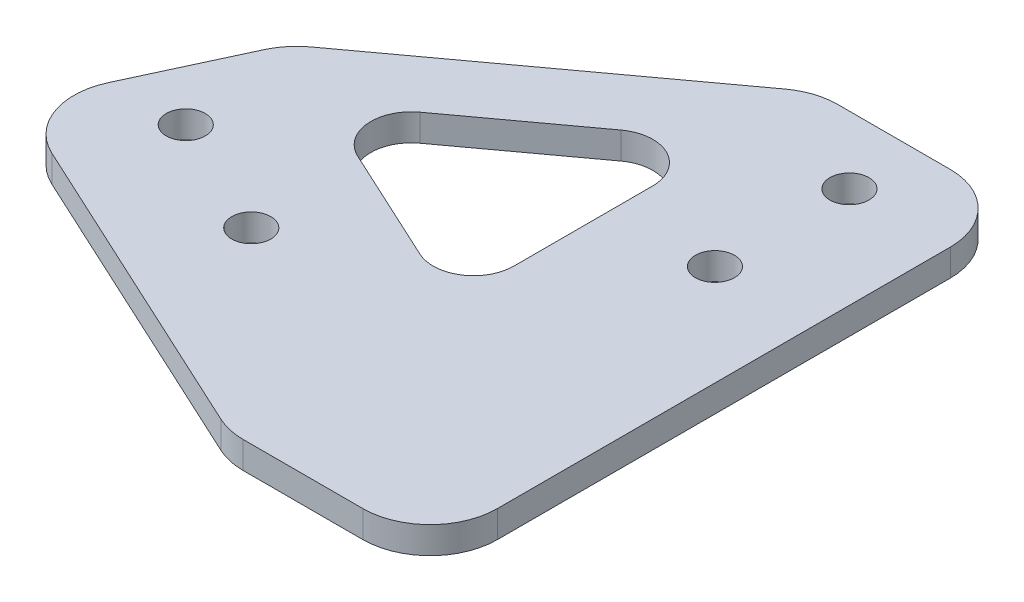
ISO-10303-21;
HEADER;
FILE_DESCRIPTION(('STEP AP214'),'2;1');
FILE_NAME('part.step','',(''),(''),'','','');
FILE_SCHEMA(('AUTOMOTIVE_DESIGN { 1 0 10303 214 1 1 1 1 }'));
ENDSEC;
DATA;
#1=APPLICATION_CONTEXT('core data for automotive mechanical design processes');
#2=APPLICATION_PROTOCOL_DEFINITION('international standard','automotive_design',2000,#1);
#3=PRODUCT_CONTEXT('',#1,'mechanical');
#4=PRODUCT('Part','Part','',(#3));
#5=PRODUCT_RELATED_PRODUCT_CATEGORY('part','',(#4));
#6=PRODUCT_DEFINITION_FORMATION('','',#4);
#7=PRODUCT_DEFINITION_CONTEXT('part definition',#1,'design');
#8=PRODUCT_DEFINITION('design','',#6,#7);
#9=PRODUCT_DEFINITION_SHAPE('','',#8);
#10=(LENGTH_UNIT() NAMED_UNIT(*) SI_UNIT(.MILLI.,.METRE.));
#11=(NAMED_UNIT(*) PLANE_ANGLE_UNIT() SI_UNIT($,.RADIAN.));
#12=(NAMED_UNIT(*) SI_UNIT($,.STERADIAN.) SOLID_ANGLE_UNIT());
#13=UNCERTAINTY_MEASURE_WITH_UNIT(LENGTH_MEASURE(1.E-05),#10,'distance_accuracy_value','');
#14=(GEOMETRIC_REPRESENTATION_CONTEXT(3) GLOBAL_UNCERTAINTY_ASSIGNED_CONTEXT((#13)) GLOBAL_UNIT_ASSIGNED_CONTEXT((#10,
#11,#12)) REPRESENTATION_CONTEXT('',''));
#15=CARTESIAN_POINT('',(0.,0.,0.));
#16=DIRECTION('',(0.,0.,1.));
#17=DIRECTION('',(1.,0.,0.));
#18=AXIS2_PLACEMENT_3D('',#15,#16,#17);
#19=CARTESIAN_POINT('',(0.,2.,0.));
#20=DIRECTION('',(0.,1.,0.));
#21=DIRECTION('',(0.,0.,1.));
#22=AXIS2_PLACEMENT_3D('',#19,#20,#21);
#23=PLANE('',#22);
#24=CARTESIAN_POINT('',(237.500000000001,2.,86.1229089448144));
#25=DIRECTION('',(0.,1.,0.));
#26=DIRECTION('',(0.,0.,1.));
#27=AXIS2_PLACEMENT_3D('',#24,#25,#26);
#28=CIRCLE('',#27,1.45);
#29=CARTESIAN_POINT('',(237.500000000001,2.,87.5729089448144));
#30=VERTEX_POINT('',#29);
#31=EDGE_CURVE('E306',#30,#30,#28,.T.);
#32=ORIENTED_EDGE('',*,*,#31,.F.);
#33=EDGE_LOOP('',(#32));
#34=FACE_BOUND('',#33,.T.);
#35=CARTESIAN_POINT('',(217.7739363203,2.,100.868789323371));
#36=DIRECTION('',(0.,1.,0.));
#37=DIRECTION('',(0.,0.,1.));
#38=AXIS2_PLACEMENT_3D('',#35,#36,#37);
#39=CIRCLE('',#38,1.45);
#40=CARTESIAN_POINT('',(217.7739363203,2.,102.318789323371));
#41=VERTEX_POINT('',#40);
#42=EDGE_CURVE('E318',#41,#41,#39,.T.);
#43=ORIENTED_EDGE('',*,*,#42,.F.);
#44=EDGE_LOOP('',(#43));
#45=FACE_BOUND('',#44,.T.);
#46=DIRECTION('',(0.907391401334581,0.,0.420286622180704));
#47=VECTOR('',#46,1.);
#48=CARTESIAN_POINT('',(201.010915633924,2.,101.369925500668));
#49=LINE('',#48,#47);
#50=CARTESIAN_POINT('',(205.547872640597,2.,103.471358611572));
#51=VERTEX_POINT('',#50);
#52=CARTESIAN_POINT('',(229.000298347795,2.,114.334080881063));
#53=VERTEX_POINT('',#52);
#54=EDGE_CURVE('E329',#51,#53,#49,.T.);
#55=ORIENTED_EDGE('',*,*,#54,.T.);
#56=CARTESIAN_POINT('',(231.101731458699,2.,109.79712387439));
#57=DIRECTION('',(0.,1.,0.));
#58=DIRECTION('',(0.,0.,1.));
#59=AXIS2_PLACEMENT_3D('',#56,#57,#58);
#60=CIRCLE('',#59,5.);
#61=CARTESIAN_POINT('',(231.101731458699,2.,114.79712387439));
#62=VERTEX_POINT('',#61);
#63=EDGE_CURVE('E228',#53,#62,#60,.T.);
#64=ORIENTED_EDGE('',*,*,#63,.T.);
#65=DIRECTION('',(1.,0.,0.));
#66=VECTOR('',#65,1.);
#67=CARTESIAN_POINT('',(229.999999999999,2.,114.79712387439));
#68=LINE('',#67,#66);
#69=CARTESIAN_POINT('',(240.000000000001,2.,114.79712387439));
#70=VERTEX_POINT('',#69);
#71=EDGE_CURVE('E185',#62,#70,#68,.T.);
#72=ORIENTED_EDGE('',*,*,#71,.T.);
#73=CARTESIAN_POINT('',(240.000000000001,2.,109.79712387439));
#74=DIRECTION('',(0.,1.,0.));
#75=DIRECTION('',(0.,0.,1.));
#76=AXIS2_PLACEMENT_3D('',#73,#74,#75);
#77=CIRCLE('',#76,5.);
#78=CARTESIAN_POINT('',(245.000000000002,2.,109.79712387439));
#79=VERTEX_POINT('',#78);
#80=EDGE_CURVE('E226',#70,#79,#77,.T.);
#81=ORIENTED_EDGE('',*,*,#80,.T.);
#82=DIRECTION('',(5.33500560267534E-13,0.,-1.));
#83=VECTOR('',#82,1.);
#84=CARTESIAN_POINT('',(244.999999999999,2.,114.79712387439));
#85=LINE('',#84,#83);
#86=CARTESIAN_POINT('',(245.00000000002,2.,76.1229089448133));
#87=VERTEX_POINT('',#86);
#88=EDGE_CURVE('E333',#79,#87,#85,.T.);
#89=ORIENTED_EDGE('',*,*,#88,.T.);
#90=CARTESIAN_POINT('',(240.,2.,76.1229089448135));
#91=DIRECTION('',(0.,1.,0.));
#92=DIRECTION('',(0.,0.,1.));
#93=AXIS2_PLACEMENT_3D('',#90,#91,#92);
#94=CIRCLE('',#93,5.);
#95=CARTESIAN_POINT('',(240.,2.,71.1229089448135));
#96=VERTEX_POINT('',#95);
#97=EDGE_CURVE('E220',#87,#96,#94,.T.);
#98=ORIENTED_EDGE('',*,*,#97,.T.);
#99=DIRECTION('',(-1.,0.,0.));
#100=VECTOR('',#99,1.);
#101=CARTESIAN_POINT('',(245.,2.,71.1229089448135));
#102=LINE('',#101,#100);
#103=CARTESIAN_POINT('',(231.636902885081,2.,71.1229089448135));
#104=VERTEX_POINT('',#103);
#105=EDGE_CURVE('E205',#96,#104,#102,.T.);
#106=ORIENTED_EDGE('',*,*,#105,.T.);
#107=CARTESIAN_POINT('',(231.636902885081,2.,76.1229089448135));
#108=DIRECTION('',(0.,1.,0.));
#109=DIRECTION('',(0.,0.,1.));
#110=AXIS2_PLACEMENT_3D('',#107,#108,#109);
#111=CIRCLE('',#110,5.);
#112=CARTESIAN_POINT('',(228.680010998357,2.,72.090937916864));
#113=VERTEX_POINT('',#112);
#114=EDGE_CURVE('E218',#104,#113,#111,.T.);
#115=ORIENTED_EDGE('',*,*,#114,.T.);
#116=DIRECTION('',(-0.806394205589891,0.,0.591378377344867));
#117=VECTOR('',#116,1.);
#118=CARTESIAN_POINT('',(230.,2.,71.1229089448135));
#119=LINE('',#118,#117);
#120=CARTESIAN_POINT('',(208.353916581868,2.,86.9973108179295));
#121=VERTEX_POINT('',#120);
#122=EDGE_CURVE('E204',#113,#121,#119,.T.);
#123=ORIENTED_EDGE('',*,*,#122,.T.);
#124=CARTESIAN_POINT('',(211.310808468593,2.,91.029281845879));
#125=DIRECTION('',(0.,1.,0.));
#126=DIRECTION('',(0.,0.,1.));
#127=AXIS2_PLACEMENT_3D('',#124,#125,#126);
#128=CIRCLE('',#127,5.);
#129=CARTESIAN_POINT('',(206.77385146192,2.,88.9278487349754));
#130=VERTEX_POINT('',#129);
#131=EDGE_CURVE('E222',#121,#130,#128,.T.);
#132=ORIENTED_EDGE('',*,*,#131,.T.);
#133=DIRECTION('',(-0.420286622180708,0.,0.907391401334579));
#134=VECTOR('',#133,1.);
#135=CARTESIAN_POINT('',(207.315214966635,2.,87.7590544806496));
#136=LINE('',#135,#134);
#137=CARTESIAN_POINT('',(203.112348744828,2.,96.8329684939954));
#138=VERTEX_POINT('',#137);
#139=EDGE_CURVE('E326',#130,#138,#136,.T.);
#140=ORIENTED_EDGE('',*,*,#139,.T.);
#141=CARTESIAN_POINT('',(207.649305751501,2.,98.9344016048989));
#142=DIRECTION('',(0.,1.,0.));
#143=DIRECTION('',(0.,0.,1.));
#144=AXIS2_PLACEMENT_3D('',#141,#142,#143);
#145=CIRCLE('',#144,5.);
#146=EDGE_CURVE('E224',#138,#51,#145,.T.);
#147=ORIENTED_EDGE('',*,*,#146,.T.);
#148=EDGE_LOOP('',(#55,#64,#72,#81,#89,#98,#106,#115,#123,#132,#140,#147));
#149=FACE_BOUND('',#148,.T.);
#150=CARTESIAN_POINT('',(208.700022306954,2.,96.6659231015634));
#151=DIRECTION('',(0.,1.,0.));
#152=DIRECTION('',(0.,0.,1.));
#153=AXIS2_PLACEMENT_3D('',#150,#151,#152);
#154=CIRCLE('',#153,1.45000000000022);
#155=CARTESIAN_POINT('',(208.700022306954,2.,98.1159231015636));
#156=VERTEX_POINT('',#155);
#157=EDGE_CURVE('E312',#156,#156,#154,.T.);
#158=ORIENTED_EDGE('',*,*,#157,.F.);
#159=EDGE_LOOP('',(#158));
#160=FACE_BOUND('',#159,.T.);
#161=CARTESIAN_POINT('',(237.500000000001,2.,76.1229089448144));
#162=DIRECTION('',(0.,1.,0.));
#163=DIRECTION('',(0.,0.,1.));
#164=AXIS2_PLACEMENT_3D('',#161,#162,#163);
#165=CIRCLE('',#164,1.45);
#166=CARTESIAN_POINT('',(237.500000000001,2.,77.5729089448144));
#167=VERTEX_POINT('',#166);
#168=EDGE_CURVE('E294',#167,#167,#165,.T.);
#169=ORIENTED_EDGE('',*,*,#168,.F.);
#170=EDGE_LOOP('',(#169));
#171=FACE_BOUND('',#170,.T.);
#172=DIRECTION('',(0.907391401334579,0.,0.420286622180708));
#173=VECTOR('',#172,1.);
#174=CARTESIAN_POINT('',(229.999999999999,2.,98.2662200351672));
#175=LINE('',#174,#173);
#176=CARTESIAN_POINT('',(217.108610296407,2.,92.2951709093225));
#177=VERTEX_POINT('',#176);
#178=CARTESIAN_POINT('',(225.739140133458,2.,96.2926699240904));
#179=VERTEX_POINT('',#178);
#180=EDGE_CURVE('E291',#177,#179,#175,.T.);
#181=ORIENTED_EDGE('',*,*,#180,.F.);
#182=CARTESIAN_POINT('',(218.369470162949,2.,89.5729967053187));
#183=DIRECTION('',(0.,1.,0.));
#184=DIRECTION('',(0.,0.,1.));
#185=AXIS2_PLACEMENT_3D('',#182,#183,#184);
#186=CIRCLE('',#185,3.);
#187=CARTESIAN_POINT('',(216.595335030915,2.,87.1538140885488));
#188=VERTEX_POINT('',#187);
#189=EDGE_CURVE('E54',#177,#188,#186,.F.);
#190=ORIENTED_EDGE('',*,*,#189,.T.);
#191=DIRECTION('',(-0.80639420558997,0.,0.59137837734476));
#192=VECTOR('',#191,1.);
#193=CARTESIAN_POINT('',(212.497179662204,2.,90.1592430155609));
#194=LINE('',#193,#192);
#195=CARTESIAN_POINT('',(225.225864867967,2.,80.8245167110616));
#196=VERTEX_POINT('',#195);
#197=EDGE_CURVE('E286',#196,#188,#194,.T.);
#198=ORIENTED_EDGE('',*,*,#197,.F.);
#199=CARTESIAN_POINT('',(227.000000000001,2.,83.2436993278316));
#200=DIRECTION('',(0.,1.,0.));
#201=DIRECTION('',(0.,0.,1.));
#202=AXIS2_PLACEMENT_3D('',#199,#200,#201);
#203=CIRCLE('',#202,3.);
#204=CARTESIAN_POINT('',(230.000000000001,2.,83.243699327832));
#205=VERTEX_POINT('',#204);
#206=EDGE_CURVE('E11',#196,#205,#203,.F.);
#207=ORIENTED_EDGE('',*,*,#206,.T.);
#208=DIRECTION('',(1.47108249049647E-13,0.,-1.));
#209=VECTOR('',#208,1.);
#210=CARTESIAN_POINT('',(230.000000000002,2.,77.3233503236594));
#211=LINE('',#210,#209);
#212=CARTESIAN_POINT('',(230.,2.,93.5704957200871));
#213=VERTEX_POINT('',#212);
#214=EDGE_CURVE('E284',#213,#205,#211,.T.);
#215=ORIENTED_EDGE('',*,*,#214,.F.);
#216=CARTESIAN_POINT('',(227.,2.,93.5704957200866));
#217=DIRECTION('',(0.,1.,0.));
#218=DIRECTION('',(0.,0.,1.));
#219=AXIS2_PLACEMENT_3D('',#216,#217,#218);
#220=CIRCLE('',#219,3.);
#221=EDGE_CURVE('E266',#213,#179,#220,.F.);
#222=ORIENTED_EDGE('',*,*,#221,.T.);
#223=EDGE_LOOP('',(#181,#190,#198,#207,#215,#222));
#224=FACE_BOUND('',#223,.T.);
#225=ADVANCED_FACE('F39',(#34,#45,#149,#160,#171,#224),#23,.T.);
#226=CARTESIAN_POINT('',(0.,0.,0.));
#227=DIRECTION('',(0.,1.,0.));
#228=DIRECTION('',(0.,0.,1.));
#229=AXIS2_PLACEMENT_3D('',#226,#227,#228);
#230=PLANE('',#229);
#231=CARTESIAN_POINT('',(237.500000000001,0.,76.1229089448144));
#232=DIRECTION('',(0.,1.,0.));
#233=DIRECTION('',(0.,0.,1.));
#234=AXIS2_PLACEMENT_3D('',#231,#232,#233);
#235=CIRCLE('',#234,1.45);
#236=CARTESIAN_POINT('',(237.500000000001,0.,77.5729089448144));
#237=VERTEX_POINT('',#236);
#238=EDGE_CURVE('E290',#237,#237,#235,.T.);
#239=ORIENTED_EDGE('',*,*,#238,.T.);
#240=EDGE_LOOP('',(#239));
#241=FACE_BOUND('',#240,.T.);
#242=CARTESIAN_POINT('',(237.500000000001,0.,86.1229089448144));
#243=DIRECTION('',(0.,1.,0.));
#244=DIRECTION('',(0.,0.,1.));
#245=AXIS2_PLACEMENT_3D('',#242,#243,#244);
#246=CIRCLE('',#245,1.45);
#247=CARTESIAN_POINT('',(237.500000000001,0.,87.5729089448144));
#248=VERTEX_POINT('',#247);
#249=EDGE_CURVE('E304',#248,#248,#246,.T.);
#250=ORIENTED_EDGE('',*,*,#249,.T.);
#251=EDGE_LOOP('',(#250));
#252=FACE_BOUND('',#251,.T.);
#253=CARTESIAN_POINT('',(208.700022306954,0.,96.6659231015634));
#254=DIRECTION('',(0.,1.,0.));
#255=DIRECTION('',(0.,0.,1.));
#256=AXIS2_PLACEMENT_3D('',#253,#254,#255);
#257=CIRCLE('',#256,1.45000000000022);
#258=CARTESIAN_POINT('',(208.700022306954,0.,98.1159231015636));
#259=VERTEX_POINT('',#258);
#260=EDGE_CURVE('E309',#259,#259,#257,.T.);
#261=ORIENTED_EDGE('',*,*,#260,.T.);
#262=EDGE_LOOP('',(#261));
#263=FACE_BOUND('',#262,.T.);
#264=CARTESIAN_POINT('',(217.7739363203,0.,100.868789323371));
#265=DIRECTION('',(0.,1.,0.));
#266=DIRECTION('',(0.,0.,1.));
#267=AXIS2_PLACEMENT_3D('',#264,#265,#266);
#268=CIRCLE('',#267,1.45);
#269=CARTESIAN_POINT('',(217.7739363203,0.,102.318789323371));
#270=VERTEX_POINT('',#269);
#271=EDGE_CURVE('E315',#270,#270,#268,.T.);
#272=ORIENTED_EDGE('',*,*,#271,.T.);
#273=EDGE_LOOP('',(#272));
#274=FACE_BOUND('',#273,.T.);
#275=DIRECTION('',(1.,0.,0.));
#276=VECTOR('',#275,1.);
#277=CARTESIAN_POINT('',(229.999999999999,0.,114.79712387439));
#278=LINE('',#277,#276);
#279=CARTESIAN_POINT('',(231.101731458699,0.,114.79712387439));
#280=VERTEX_POINT('',#279);
#281=CARTESIAN_POINT('',(240.000000000001,0.,114.79712387439));
#282=VERTEX_POINT('',#281);
#283=EDGE_CURVE('E182',#280,#282,#278,.T.);
#284=ORIENTED_EDGE('',*,*,#283,.F.);
#285=CARTESIAN_POINT('',(231.101731458699,0.,109.79712387439));
#286=DIRECTION('',(0.,1.,0.));
#287=DIRECTION('',(0.,0.,1.));
#288=AXIS2_PLACEMENT_3D('',#285,#286,#287);
#289=CIRCLE('',#288,5.);
#290=CARTESIAN_POINT('',(229.000298347795,0.,114.334080881063));
#291=VERTEX_POINT('',#290);
#292=EDGE_CURVE('E165',#280,#291,#289,.F.);
#293=ORIENTED_EDGE('',*,*,#292,.T.);
#294=DIRECTION('',(0.907391401334581,0.,0.420286622180704));
#295=VECTOR('',#294,1.);
#296=CARTESIAN_POINT('',(201.010915633924,0.,101.369925500668));
#297=LINE('',#296,#295);
#298=CARTESIAN_POINT('',(205.547872640597,0.,103.471358611572));
#299=VERTEX_POINT('',#298);
#300=EDGE_CURVE('E193',#299,#291,#297,.T.);
#301=ORIENTED_EDGE('',*,*,#300,.F.);
#302=CARTESIAN_POINT('',(207.649305751501,0.,98.9344016048989));
#303=DIRECTION('',(0.,1.,0.));
#304=DIRECTION('',(0.,0.,1.));
#305=AXIS2_PLACEMENT_3D('',#302,#303,#304);
#306=CIRCLE('',#305,5.);
#307=CARTESIAN_POINT('',(203.112348744828,0.,96.8329684939954));
#308=VERTEX_POINT('',#307);
#309=EDGE_CURVE('E212',#299,#308,#306,.F.);
#310=ORIENTED_EDGE('',*,*,#309,.T.);
#311=DIRECTION('',(-0.420286622180708,0.,0.907391401334579));
#312=VECTOR('',#311,1.);
#313=CARTESIAN_POINT('',(207.315214966635,0.,87.7590544806496));
#314=LINE('',#313,#312);
#315=CARTESIAN_POINT('',(206.77385146192,0.,88.9278487349754));
#316=VERTEX_POINT('',#315);
#317=EDGE_CURVE('E198',#316,#308,#314,.T.);
#318=ORIENTED_EDGE('',*,*,#317,.F.);
#319=CARTESIAN_POINT('',(211.310808468593,0.,91.029281845879));
#320=DIRECTION('',(0.,1.,0.));
#321=DIRECTION('',(0.,0.,1.));
#322=AXIS2_PLACEMENT_3D('',#319,#320,#321);
#323=CIRCLE('',#322,5.);
#324=CARTESIAN_POINT('',(208.353916581868,0.,86.9973108179295));
#325=VERTEX_POINT('',#324);
#326=EDGE_CURVE('E210',#316,#325,#323,.F.);
#327=ORIENTED_EDGE('',*,*,#326,.T.);
#328=DIRECTION('',(-0.806394205589891,0.,0.591378377344867));
#329=VECTOR('',#328,1.);
#330=CARTESIAN_POINT('',(230.,0.,71.1229089448135));
#331=LINE('',#330,#329);
#332=CARTESIAN_POINT('',(228.680010998357,0.,72.090937916864));
#333=VERTEX_POINT('',#332);
#334=EDGE_CURVE('E321',#333,#325,#331,.T.);
#335=ORIENTED_EDGE('',*,*,#334,.F.);
#336=CARTESIAN_POINT('',(231.636902885081,0.,76.1229089448135));
#337=DIRECTION('',(0.,1.,0.));
#338=DIRECTION('',(0.,0.,1.));
#339=AXIS2_PLACEMENT_3D('',#336,#337,#338);
#340=CIRCLE('',#339,5.);
#341=CARTESIAN_POINT('',(231.636902885081,0.,71.1229089448135));
#342=VERTEX_POINT('',#341);
#343=EDGE_CURVE('E186',#333,#342,#340,.F.);
#344=ORIENTED_EDGE('',*,*,#343,.T.);
#345=DIRECTION('',(-1.,0.,0.));
#346=VECTOR('',#345,1.);
#347=CARTESIAN_POINT('',(245.,0.,71.1229089448135));
#348=LINE('',#347,#346);
#349=CARTESIAN_POINT('',(240.,0.,71.1229089448135));
#350=VERTEX_POINT('',#349);
#351=EDGE_CURVE('E196',#350,#342,#348,.T.);
#352=ORIENTED_EDGE('',*,*,#351,.F.);
#353=CARTESIAN_POINT('',(240.,0.,76.1229089448135));
#354=DIRECTION('',(0.,1.,0.));
#355=DIRECTION('',(0.,0.,1.));
#356=AXIS2_PLACEMENT_3D('',#353,#354,#355);
#357=CIRCLE('',#356,5.);
#358=CARTESIAN_POINT('',(245.,0.,76.1229089448133));
#359=VERTEX_POINT('',#358);
#360=EDGE_CURVE('E208',#350,#359,#357,.F.);
#361=ORIENTED_EDGE('',*,*,#360,.T.);
#362=DIRECTION('',(0.,0.,-1.));
#363=VECTOR('',#362,1.);
#364=CARTESIAN_POINT('',(245.000000000001,0.,111.6235749812));
#365=LINE('',#364,#363);
#366=CARTESIAN_POINT('',(245.000000000001,0.,109.79712387439));
#367=VERTEX_POINT('',#366);
#368=EDGE_CURVE('E192',#367,#359,#365,.T.);
#369=ORIENTED_EDGE('',*,*,#368,.F.);
#370=CARTESIAN_POINT('',(240.000000000001,0.,109.79712387439));
#371=DIRECTION('',(0.,1.,0.));
#372=DIRECTION('',(0.,0.,1.));
#373=AXIS2_PLACEMENT_3D('',#370,#371,#372);
#374=CIRCLE('',#373,5.);
#375=EDGE_CURVE('E176',#367,#282,#374,.F.);
#376=ORIENTED_EDGE('',*,*,#375,.T.);
#377=EDGE_LOOP('',(#284,#293,#301,#310,#318,#327,#335,#344,#352,#361,#369,#376));
#378=FACE_BOUND('',#377,.T.);
#379=DIRECTION('',(1.47108249049647E-13,0.,-1.));
#380=VECTOR('',#379,1.);
#381=CARTESIAN_POINT('',(230.000000000002,0.,77.3233503236594));
#382=LINE('',#381,#380);
#383=CARTESIAN_POINT('',(230.,0.,93.5704957200871));
#384=VERTEX_POINT('',#383);
#385=CARTESIAN_POINT('',(230.000000000001,0.,83.243699327832));
#386=VERTEX_POINT('',#385);
#387=EDGE_CURVE('E274',#384,#386,#382,.T.);
#388=ORIENTED_EDGE('',*,*,#387,.T.);
#389=CARTESIAN_POINT('',(227.000000000001,0.,83.2436993278316));
#390=DIRECTION('',(0.,1.,0.));
#391=DIRECTION('',(0.,0.,1.));
#392=AXIS2_PLACEMENT_3D('',#389,#390,#391);
#393=CIRCLE('',#392,3.);
#394=CARTESIAN_POINT('',(225.225864867967,0.,80.8245167110616));
#395=VERTEX_POINT('',#394);
#396=EDGE_CURVE('E47',#386,#395,#393,.T.);
#397=ORIENTED_EDGE('',*,*,#396,.T.);
#398=DIRECTION('',(-0.80639420558997,0.,0.59137837734476));
#399=VECTOR('',#398,1.);
#400=CARTESIAN_POINT('',(212.497179662204,0.,90.1592430155609));
#401=LINE('',#400,#399);
#402=CARTESIAN_POINT('',(216.595335030915,0.,87.1538140885488));
#403=VERTEX_POINT('',#402);
#404=EDGE_CURVE('E272',#395,#403,#401,.T.);
#405=ORIENTED_EDGE('',*,*,#404,.T.);
#406=CARTESIAN_POINT('',(218.369470162949,0.,89.5729967053187));
#407=DIRECTION('',(0.,1.,0.));
#408=DIRECTION('',(0.,0.,1.));
#409=AXIS2_PLACEMENT_3D('',#406,#407,#408);
#410=CIRCLE('',#409,3.);
#411=CARTESIAN_POINT('',(217.108610296407,0.,92.2951709093225));
#412=VERTEX_POINT('',#411);
#413=EDGE_CURVE('E268',#403,#412,#410,.T.);
#414=ORIENTED_EDGE('',*,*,#413,.T.);
#415=DIRECTION('',(0.907391401334579,0.,0.420286622180708));
#416=VECTOR('',#415,1.);
#417=CARTESIAN_POINT('',(229.999999999999,0.,98.2662200351672));
#418=LINE('',#417,#416);
#419=CARTESIAN_POINT('',(225.739140133458,0.,96.2926699240904));
#420=VERTEX_POINT('',#419);
#421=EDGE_CURVE('E279',#412,#420,#418,.T.);
#422=ORIENTED_EDGE('',*,*,#421,.T.);
#423=CARTESIAN_POINT('',(227.,0.,93.5704957200866));
#424=DIRECTION('',(0.,1.,0.));
#425=DIRECTION('',(0.,0.,1.));
#426=AXIS2_PLACEMENT_3D('',#423,#424,#425);
#427=CIRCLE('',#426,3.);
#428=EDGE_CURVE('E264',#420,#384,#427,.T.);
#429=ORIENTED_EDGE('',*,*,#428,.T.);
#430=EDGE_LOOP('',(#388,#397,#405,#414,#422,#429));
#431=FACE_BOUND('',#430,.T.);
#432=ADVANCED_FACE('F189',(#241,#252,#263,#274,#378,#431),#230,.F.);
#433=CARTESIAN_POINT('',(230.,2.,71.1229089448135));
#434=DIRECTION('',(0.591378377344867,0.,0.806394205589891));
#435=DIRECTION('',(0.806394205589891,0.,-0.591378377344867));
#436=AXIS2_PLACEMENT_3D('',#433,#434,#435);
#437=PLANE('',#436);
#438=ORIENTED_EDGE('',*,*,#334,.T.);
#439=DIRECTION('',(0.,-1.,0.));
#440=VECTOR('',#439,1.);
#441=CARTESIAN_POINT('',(208.353916581868,2.,86.9973108179295));
#442=LINE('',#441,#440);
#443=EDGE_CURVE('E243',#325,#121,#442,.F.);
#444=ORIENTED_EDGE('',*,*,#443,.T.);
#445=ORIENTED_EDGE('',*,*,#122,.F.);
#446=DIRECTION('',(0.,-1.,0.));
#447=VECTOR('',#446,1.);
#448=CARTESIAN_POINT('',(228.680010998357,2.,72.090937916864));
#449=LINE('',#448,#447);
#450=EDGE_CURVE('E240',#113,#333,#449,.T.);
#451=ORIENTED_EDGE('',*,*,#450,.T.);
#452=EDGE_LOOP('',(#438,#444,#445,#451));
#453=FACE_BOUND('',#452,.T.);
#454=ADVANCED_FACE('F363',(#453),#437,.F.);
#455=CARTESIAN_POINT('',(207.315214966635,2.,87.7590544806496));
#456=DIRECTION('',(0.907391401334579,0.,0.420286622180708));
#457=DIRECTION('',(0.420286622180708,0.,-0.907391401334579));
#458=AXIS2_PLACEMENT_3D('',#455,#456,#457);
#459=PLANE('',#458);
#460=ORIENTED_EDGE('',*,*,#317,.T.);
#461=DIRECTION('',(0.,-1.,0.));
#462=VECTOR('',#461,1.);
#463=CARTESIAN_POINT('',(203.112348744828,2.,96.8329684939954));
#464=LINE('',#463,#462);
#465=EDGE_CURVE('E238',#308,#138,#464,.F.);
#466=ORIENTED_EDGE('',*,*,#465,.T.);
#467=ORIENTED_EDGE('',*,*,#139,.F.);
#468=DIRECTION('',(0.,-1.,0.));
#469=VECTOR('',#468,1.);
#470=CARTESIAN_POINT('',(206.77385146192,2.,88.9278487349754));
#471=LINE('',#470,#469);
#472=EDGE_CURVE('E235',#130,#316,#471,.T.);
#473=ORIENTED_EDGE('',*,*,#472,.T.);
#474=EDGE_LOOP('',(#460,#466,#467,#473));
#475=FACE_BOUND('',#474,.T.);
#476=ADVANCED_FACE('F343',(#475),#459,.F.);
#477=CARTESIAN_POINT('',(201.010915633924,2.,101.369925500668));
#478=DIRECTION('',(0.420286622180704,0.,-0.907391401334581));
#479=DIRECTION('',(-0.907391401334581,0.,-0.420286622180704));
#480=AXIS2_PLACEMENT_3D('',#477,#478,#479);
#481=PLANE('',#480);
#482=ORIENTED_EDGE('',*,*,#300,.T.);
#483=DIRECTION('',(0.,-1.,0.));
#484=VECTOR('',#483,1.);
#485=CARTESIAN_POINT('',(229.000298347795,2.,114.334080881063));
#486=LINE('',#485,#484);
#487=EDGE_CURVE('E170',#291,#53,#486,.F.);
#488=ORIENTED_EDGE('',*,*,#487,.T.);
#489=ORIENTED_EDGE('',*,*,#54,.F.);
#490=DIRECTION('',(0.,-1.,0.));
#491=VECTOR('',#490,1.);
#492=CARTESIAN_POINT('',(205.547872640597,2.,103.471358611572));
#493=LINE('',#492,#491);
#494=EDGE_CURVE('E175',#51,#299,#493,.T.);
#495=ORIENTED_EDGE('',*,*,#494,.T.);
#496=EDGE_LOOP('',(#482,#488,#489,#495));
#497=FACE_BOUND('',#496,.T.);
#498=ADVANCED_FACE('F354',(#497),#481,.F.);
#499=CARTESIAN_POINT('',(229.999999999999,2.,114.79712387439));
#500=DIRECTION('',(0.,0.,-1.));
#501=DIRECTION('',(-1.,0.,0.));
#502=AXIS2_PLACEMENT_3D('',#499,#500,#501);
#503=PLANE('',#502);
#504=ORIENTED_EDGE('',*,*,#71,.F.);
#505=DIRECTION('',(0.,-1.,0.));
#506=VECTOR('',#505,1.);
#507=CARTESIAN_POINT('',(231.101731458699,2.,114.79712387439));
#508=LINE('',#507,#506);
#509=EDGE_CURVE('E169',#62,#280,#508,.T.);
#510=ORIENTED_EDGE('',*,*,#509,.T.);
#511=ORIENTED_EDGE('',*,*,#283,.T.);
#512=DIRECTION('',(0.,-1.,0.));
#513=VECTOR('',#512,1.);
#514=CARTESIAN_POINT('',(240.000000000001,2.,114.79712387439));
#515=LINE('',#514,#513);
#516=EDGE_CURVE('E187',#282,#70,#515,.F.);
#517=ORIENTED_EDGE('',*,*,#516,.T.);
#518=EDGE_LOOP('',(#504,#510,#511,#517));
#519=FACE_BOUND('',#518,.T.);
#520=ADVANCED_FACE('F181',(#519),#503,.F.);
#521=CARTESIAN_POINT('',(245.000000000001,2.,111.6235749812));
#522=DIRECTION('',(-1.,0.,0.));
#523=DIRECTION('',(0.,0.,1.));
#524=AXIS2_PLACEMENT_3D('',#521,#522,#523);
#525=PLANE('',#524);
#526=ORIENTED_EDGE('',*,*,#88,.F.);
#527=DIRECTION('',(0.,-1.,0.));
#528=VECTOR('',#527,1.);
#529=CARTESIAN_POINT('',(245.000000000001,2.,109.79712387439));
#530=LINE('',#529,#528);
#531=EDGE_CURVE('E232',#79,#367,#530,.T.);
#532=ORIENTED_EDGE('',*,*,#531,.T.);
#533=ORIENTED_EDGE('',*,*,#368,.T.);
#534=DIRECTION('',(0.,-1.,0.));
#535=VECTOR('',#534,1.);
#536=CARTESIAN_POINT('',(245.,2.,76.1229089448133));
#537=LINE('',#536,#535);
#538=EDGE_CURVE('E230',#359,#87,#537,.F.);
#539=ORIENTED_EDGE('',*,*,#538,.T.);
#540=EDGE_LOOP('',(#526,#532,#533,#539));
#541=FACE_BOUND('',#540,.T.);
#542=ADVANCED_FACE('F361',(#541),#525,.F.);
#543=CARTESIAN_POINT('',(245.,2.,71.1229089448135));
#544=DIRECTION('',(0.,0.,1.));
#545=DIRECTION('',(1.,0.,0.));
#546=AXIS2_PLACEMENT_3D('',#543,#544,#545);
#547=PLANE('',#546);
#548=ORIENTED_EDGE('',*,*,#105,.F.);
#549=DIRECTION('',(0.,-1.,0.));
#550=VECTOR('',#549,1.);
#551=CARTESIAN_POINT('',(240.,2.,71.1229089448135));
#552=LINE('',#551,#550);
#553=EDGE_CURVE('E247',#96,#350,#552,.T.);
#554=ORIENTED_EDGE('',*,*,#553,.T.);
#555=ORIENTED_EDGE('',*,*,#351,.T.);
#556=DIRECTION('',(0.,-1.,0.));
#557=VECTOR('',#556,1.);
#558=CARTESIAN_POINT('',(231.636902885081,2.,71.1229089448135));
#559=LINE('',#558,#557);
#560=EDGE_CURVE('E245',#342,#104,#559,.F.);
#561=ORIENTED_EDGE('',*,*,#560,.T.);
#562=EDGE_LOOP('',(#548,#554,#555,#561));
#563=FACE_BOUND('',#562,.T.);
#564=ADVANCED_FACE('F380',(#563),#547,.F.);
#565=CARTESIAN_POINT('',(217.7739363203,2.,100.868789323371));
#566=DIRECTION('',(0.,-1.,0.));
#567=DIRECTION('',(0.,0.,-1.));
#568=AXIS2_PLACEMENT_3D('',#565,#566,#567);
#569=CYLINDRICAL_SURFACE('',#568,1.45);
#570=ORIENTED_EDGE('',*,*,#42,.T.);
#571=EDGE_LOOP('',(#570));
#572=FACE_BOUND('',#571,.T.);
#573=ORIENTED_EDGE('',*,*,#271,.F.);
#574=EDGE_LOOP('',(#573));
#575=FACE_BOUND('',#574,.T.);
#576=ADVANCED_FACE('F377',(#572,#575),#569,.F.);
#577=CARTESIAN_POINT('',(208.700022306954,2.,96.6659231015634));
#578=DIRECTION('',(0.,-1.,0.));
#579=DIRECTION('',(0.,0.,-1.));
#580=AXIS2_PLACEMENT_3D('',#577,#578,#579);
#581=CYLINDRICAL_SURFACE('',#580,1.45000000000022);
#582=ORIENTED_EDGE('',*,*,#157,.T.);
#583=EDGE_LOOP('',(#582));
#584=FACE_BOUND('',#583,.T.);
#585=ORIENTED_EDGE('',*,*,#260,.F.);
#586=EDGE_LOOP('',(#585));
#587=FACE_BOUND('',#586,.T.);
#588=ADVANCED_FACE('F445',(#584,#587),#581,.F.);
#589=CARTESIAN_POINT('',(237.500000000001,2.,86.1229089448144));
#590=DIRECTION('',(0.,-1.,0.));
#591=DIRECTION('',(0.,0.,-1.));
#592=AXIS2_PLACEMENT_3D('',#589,#590,#591);
#593=CYLINDRICAL_SURFACE('',#592,1.45);
#594=ORIENTED_EDGE('',*,*,#31,.T.);
#595=EDGE_LOOP('',(#594));
#596=FACE_BOUND('',#595,.T.);
#597=ORIENTED_EDGE('',*,*,#249,.F.);
#598=EDGE_LOOP('',(#597));
#599=FACE_BOUND('',#598,.T.);
#600=ADVANCED_FACE('F442',(#596,#599),#593,.F.);
#601=CARTESIAN_POINT('',(237.500000000001,2.,76.1229089448144));
#602=DIRECTION('',(0.,-1.,0.));
#603=DIRECTION('',(0.,0.,-1.));
#604=AXIS2_PLACEMENT_3D('',#601,#602,#603);
#605=CYLINDRICAL_SURFACE('',#604,1.45);
#606=ORIENTED_EDGE('',*,*,#168,.T.);
#607=EDGE_LOOP('',(#606));
#608=FACE_BOUND('',#607,.T.);
#609=ORIENTED_EDGE('',*,*,#238,.F.);
#610=EDGE_LOOP('',(#609));
#611=FACE_BOUND('',#610,.T.);
#612=ADVANCED_FACE('F437',(#608,#611),#605,.F.);
#613=CARTESIAN_POINT('',(212.497179662204,2.,90.1592430155609));
#614=DIRECTION('',(0.59137837734476,0.,0.80639420558997));
#615=DIRECTION('',(0.80639420558997,0.,-0.59137837734476));
#616=AXIS2_PLACEMENT_3D('',#613,#614,#615);
#617=PLANE('',#616);
#618=ORIENTED_EDGE('',*,*,#197,.T.);
#619=DIRECTION('',(0.,-1.,0.));
#620=VECTOR('',#619,1.);
#621=CARTESIAN_POINT('',(216.595335030915,0.,87.1538140885488));
#622=LINE('',#621,#620);
#623=EDGE_CURVE('E261',#188,#403,#622,.T.);
#624=ORIENTED_EDGE('',*,*,#623,.T.);
#625=ORIENTED_EDGE('',*,*,#404,.F.);
#626=DIRECTION('',(0.,-1.,0.));
#627=VECTOR('',#626,1.);
#628=CARTESIAN_POINT('',(225.225864867967,2.,80.8245167110616));
#629=LINE('',#628,#627);
#630=EDGE_CURVE('E61',#395,#196,#629,.F.);
#631=ORIENTED_EDGE('',*,*,#630,.T.);
#632=EDGE_LOOP('',(#618,#624,#625,#631));
#633=FACE_BOUND('',#632,.T.);
#634=ADVANCED_FACE('F277',(#633),#617,.T.);
#635=CARTESIAN_POINT('',(229.999999999999,2.,98.2662200351672));
#636=DIRECTION('',(0.420286622180708,0.,-0.907391401334579));
#637=DIRECTION('',(-0.907391401334579,0.,-0.420286622180708));
#638=AXIS2_PLACEMENT_3D('',#635,#636,#637);
#639=PLANE('',#638);
#640=ORIENTED_EDGE('',*,*,#180,.T.);
#641=DIRECTION('',(0.,-1.,0.));
#642=VECTOR('',#641,1.);
#643=CARTESIAN_POINT('',(225.739140133458,0.,96.2926699240904));
#644=LINE('',#643,#642);
#645=EDGE_CURVE('E252',#179,#420,#644,.T.);
#646=ORIENTED_EDGE('',*,*,#645,.T.);
#647=ORIENTED_EDGE('',*,*,#421,.F.);
#648=DIRECTION('',(0.,-1.,0.));
#649=VECTOR('',#648,1.);
#650=CARTESIAN_POINT('',(217.108610296407,2.,92.2951709093225));
#651=LINE('',#650,#649);
#652=EDGE_CURVE('E250',#412,#177,#651,.F.);
#653=ORIENTED_EDGE('',*,*,#652,.T.);
#654=EDGE_LOOP('',(#640,#646,#647,#653));
#655=FACE_BOUND('',#654,.T.);
#656=ADVANCED_FACE('F428',(#655),#639,.T.);
#657=CARTESIAN_POINT('',(230.000000000002,2.,77.3233503236594));
#658=DIRECTION('',(-1.,0.,-1.47108249049647E-13));
#659=DIRECTION('',(-1.47108249049647E-13,0.,1.));
#660=AXIS2_PLACEMENT_3D('',#657,#658,#659);
#661=PLANE('',#660);
#662=ORIENTED_EDGE('',*,*,#387,.F.);
#663=DIRECTION('',(0.,-1.,0.));
#664=VECTOR('',#663,1.);
#665=CARTESIAN_POINT('',(230.,2.,93.5704957200871));
#666=LINE('',#665,#664);
#667=EDGE_CURVE('E258',#384,#213,#666,.F.);
#668=ORIENTED_EDGE('',*,*,#667,.T.);
#669=ORIENTED_EDGE('',*,*,#214,.T.);
#670=DIRECTION('',(0.,-1.,0.));
#671=VECTOR('',#670,1.);
#672=CARTESIAN_POINT('',(230.000000000001,0.,83.243699327832));
#673=LINE('',#672,#671);
#674=EDGE_CURVE('E255',#205,#386,#673,.T.);
#675=ORIENTED_EDGE('',*,*,#674,.T.);
#676=EDGE_LOOP('',(#662,#668,#669,#675));
#677=FACE_BOUND('',#676,.T.);
#678=ADVANCED_FACE('F288',(#677),#661,.T.);
#679=CARTESIAN_POINT('',(231.101731458699,2.,109.79712387439));
#680=DIRECTION('',(0.,-1.,0.));
#681=DIRECTION('',(0.,0.,-1.));
#682=AXIS2_PLACEMENT_3D('',#679,#680,#681);
#683=CYLINDRICAL_SURFACE('',#682,5.);
#684=ORIENTED_EDGE('',*,*,#63,.F.);
#685=ORIENTED_EDGE('',*,*,#487,.F.);
#686=ORIENTED_EDGE('',*,*,#292,.F.);
#687=ORIENTED_EDGE('',*,*,#509,.F.);
#688=EDGE_LOOP('',(#684,#685,#686,#687));
#689=FACE_BOUND('',#688,.T.);
#690=ADVANCED_FACE('F168',(#689),#683,.T.);
#691=CARTESIAN_POINT('',(240.000000000001,2.,109.79712387439));
#692=DIRECTION('',(0.,-1.,0.));
#693=DIRECTION('',(0.,0.,-1.));
#694=AXIS2_PLACEMENT_3D('',#691,#692,#693);
#695=CYLINDRICAL_SURFACE('',#694,5.);
#696=ORIENTED_EDGE('',*,*,#80,.F.);
#697=ORIENTED_EDGE('',*,*,#516,.F.);
#698=ORIENTED_EDGE('',*,*,#375,.F.);
#699=ORIENTED_EDGE('',*,*,#531,.F.);
#700=EDGE_LOOP('',(#696,#697,#698,#699));
#701=FACE_BOUND('',#700,.T.);
#702=ADVANCED_FACE('F394',(#701),#695,.T.);
#703=CARTESIAN_POINT('',(207.649305751501,2.,98.9344016048989));
#704=DIRECTION('',(0.,-1.,0.));
#705=DIRECTION('',(0.,0.,-1.));
#706=AXIS2_PLACEMENT_3D('',#703,#704,#705);
#707=CYLINDRICAL_SURFACE('',#706,5.);
#708=ORIENTED_EDGE('',*,*,#146,.F.);
#709=ORIENTED_EDGE('',*,*,#465,.F.);
#710=ORIENTED_EDGE('',*,*,#309,.F.);
#711=ORIENTED_EDGE('',*,*,#494,.F.);
#712=EDGE_LOOP('',(#708,#709,#710,#711));
#713=FACE_BOUND('',#712,.T.);
#714=ADVANCED_FACE('F348',(#713),#707,.T.);
#715=CARTESIAN_POINT('',(211.310808468593,2.,91.029281845879));
#716=DIRECTION('',(0.,-1.,0.));
#717=DIRECTION('',(0.,0.,-1.));
#718=AXIS2_PLACEMENT_3D('',#715,#716,#717);
#719=CYLINDRICAL_SURFACE('',#718,5.);
#720=ORIENTED_EDGE('',*,*,#131,.F.);
#721=ORIENTED_EDGE('',*,*,#443,.F.);
#722=ORIENTED_EDGE('',*,*,#326,.F.);
#723=ORIENTED_EDGE('',*,*,#472,.F.);
#724=EDGE_LOOP('',(#720,#721,#722,#723));
#725=FACE_BOUND('',#724,.T.);
#726=ADVANCED_FACE('F401',(#725),#719,.T.);
#727=CARTESIAN_POINT('',(240.,2.,76.1229089448135));
#728=DIRECTION('',(0.,-1.,0.));
#729=DIRECTION('',(0.,0.,-1.));
#730=AXIS2_PLACEMENT_3D('',#727,#728,#729);
#731=CYLINDRICAL_SURFACE('',#730,5.);
#732=ORIENTED_EDGE('',*,*,#97,.F.);
#733=ORIENTED_EDGE('',*,*,#538,.F.);
#734=ORIENTED_EDGE('',*,*,#360,.F.);
#735=ORIENTED_EDGE('',*,*,#553,.F.);
#736=EDGE_LOOP('',(#732,#733,#734,#735));
#737=FACE_BOUND('',#736,.T.);
#738=ADVANCED_FACE('F408',(#737),#731,.T.);
#739=CARTESIAN_POINT('',(231.636902885081,2.,76.1229089448135));
#740=DIRECTION('',(0.,-1.,0.));
#741=DIRECTION('',(0.,0.,-1.));
#742=AXIS2_PLACEMENT_3D('',#739,#740,#741);
#743=CYLINDRICAL_SURFACE('',#742,5.);
#744=ORIENTED_EDGE('',*,*,#114,.F.);
#745=ORIENTED_EDGE('',*,*,#560,.F.);
#746=ORIENTED_EDGE('',*,*,#343,.F.);
#747=ORIENTED_EDGE('',*,*,#450,.F.);
#748=EDGE_LOOP('',(#744,#745,#746,#747));
#749=FACE_BOUND('',#748,.T.);
#750=ADVANCED_FACE('F412',(#749),#743,.T.);
#751=CARTESIAN_POINT('',(227.,2.,93.5704957200866));
#752=DIRECTION('',(0.,1.,0.));
#753=DIRECTION('',(0.,0.,1.));
#754=AXIS2_PLACEMENT_3D('',#751,#752,#753);
#755=CYLINDRICAL_SURFACE('',#754,3.);
#756=ORIENTED_EDGE('',*,*,#221,.F.);
#757=ORIENTED_EDGE('',*,*,#667,.F.);
#758=ORIENTED_EDGE('',*,*,#428,.F.);
#759=ORIENTED_EDGE('',*,*,#645,.F.);
#760=EDGE_LOOP('',(#756,#757,#758,#759));
#761=FACE_BOUND('',#760,.T.);
#762=ADVANCED_FACE('F415',(#761),#755,.F.);
#763=CARTESIAN_POINT('',(218.369470162949,2.,89.5729967053187));
#764=DIRECTION('',(0.,1.,0.));
#765=DIRECTION('',(0.,0.,1.));
#766=AXIS2_PLACEMENT_3D('',#763,#764,#765);
#767=CYLINDRICAL_SURFACE('',#766,3.);
#768=ORIENTED_EDGE('',*,*,#189,.F.);
#769=ORIENTED_EDGE('',*,*,#652,.F.);
#770=ORIENTED_EDGE('',*,*,#413,.F.);
#771=ORIENTED_EDGE('',*,*,#623,.F.);
#772=EDGE_LOOP('',(#768,#769,#770,#771));
#773=FACE_BOUND('',#772,.T.);
#774=ADVANCED_FACE('F418',(#773),#767,.F.);
#775=CARTESIAN_POINT('',(227.000000000001,2.,83.2436993278316));
#776=DIRECTION('',(0.,1.,0.));
#777=DIRECTION('',(0.,0.,1.));
#778=AXIS2_PLACEMENT_3D('',#775,#776,#777);
#779=CYLINDRICAL_SURFACE('',#778,3.);
#780=ORIENTED_EDGE('',*,*,#206,.F.);
#781=ORIENTED_EDGE('',*,*,#630,.F.);
#782=ORIENTED_EDGE('',*,*,#396,.F.);
#783=ORIENTED_EDGE('',*,*,#674,.F.);
#784=EDGE_LOOP('',(#780,#781,#782,#783));
#785=FACE_BOUND('',#784,.T.);
#786=ADVANCED_FACE('F41',(#785),#779,.F.);
#787=CLOSED_SHELL('',(#225,#432,#454,#476,#498,#520,#542,#564,#576,#588,#600,#612,#634,#656,
#678,#690,#702,#714,#726,#738,#750,#762,#774,#786));
#788=MANIFOLD_SOLID_BREP('B2',#787);
#789=ADVANCED_BREP_SHAPE_REPRESENTATION('',(#18,#788),#14);
#790=SHAPE_DEFINITION_REPRESENTATION(#9,#789);
ENDSEC;
END-ISO-10303-21;
